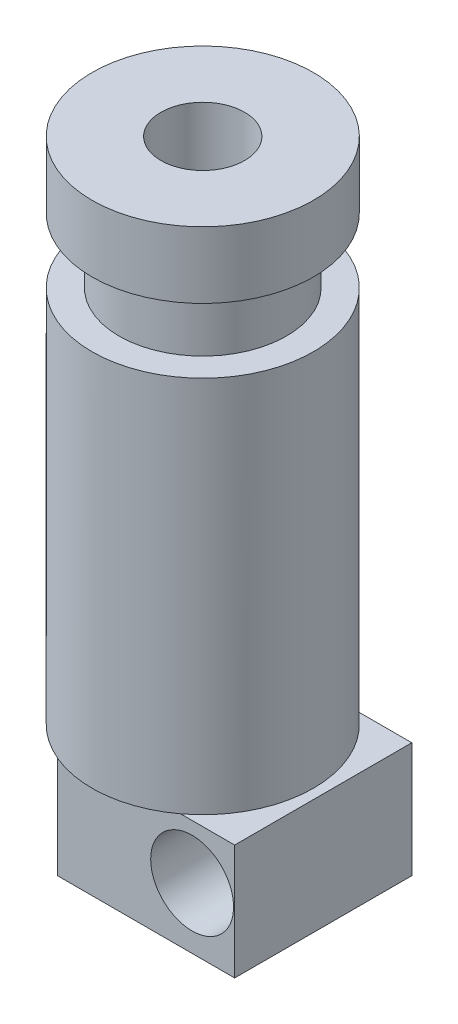
ISO-10303-21;
HEADER;
FILE_DESCRIPTION(('STEP AP214'),'2;1');
FILE_NAME('part.step','',(''),(''),'','','');
FILE_SCHEMA(('AUTOMOTIVE_DESIGN { 1 0 10303 214 1 1 1 1 }'));
ENDSEC;
DATA;
#1=APPLICATION_CONTEXT('core data for automotive mechanical design processes');
#2=APPLICATION_PROTOCOL_DEFINITION('international standard','automotive_design',2000,#1);
#3=PRODUCT_CONTEXT('',#1,'mechanical');
#4=PRODUCT('Part','Part','',(#3));
#5=PRODUCT_RELATED_PRODUCT_CATEGORY('part','',(#4));
#6=PRODUCT_DEFINITION_FORMATION('','',#4);
#7=PRODUCT_DEFINITION_CONTEXT('part definition',#1,'design');
#8=PRODUCT_DEFINITION('design','',#6,#7);
#9=PRODUCT_DEFINITION_SHAPE('','',#8);
#10=(LENGTH_UNIT() NAMED_UNIT(*) SI_UNIT(.MILLI.,.METRE.));
#11=(NAMED_UNIT(*) PLANE_ANGLE_UNIT() SI_UNIT($,.RADIAN.));
#12=(NAMED_UNIT(*) SI_UNIT($,.STERADIAN.) SOLID_ANGLE_UNIT());
#13=UNCERTAINTY_MEASURE_WITH_UNIT(LENGTH_MEASURE(1.E-05),#10,'distance_accuracy_value','');
#14=(GEOMETRIC_REPRESENTATION_CONTEXT(3) GLOBAL_UNCERTAINTY_ASSIGNED_CONTEXT((#13)) GLOBAL_UNIT_ASSIGNED_CONTEXT((#10,
#11,#12)) REPRESENTATION_CONTEXT('',''));
#15=CARTESIAN_POINT('',(0.,0.,0.));
#16=DIRECTION('',(0.,0.,1.));
#17=DIRECTION('',(1.,0.,0.));
#18=AXIS2_PLACEMENT_3D('',#15,#16,#17);
#19=CARTESIAN_POINT('',(0.,-8.255,0.));
#20=DIRECTION('',(0.,1.,0.));
#21=DIRECTION('',(0.,0.,1.));
#22=AXIS2_PLACEMENT_3D('',#19,#20,#21);
#23=PLANE('',#22);
#24=DIRECTION('',(0.,0.,-1.));
#25=VECTOR('',#24,1.);
#26=CARTESIAN_POINT('',(-4.064,-8.255,-6.35));
#27=LINE('',#26,#25);
#28=CARTESIAN_POINT('',(-4.064,-8.255,6.35));
#29=VERTEX_POINT('',#28);
#30=CARTESIAN_POINT('',(-4.064,-8.255,-6.35));
#31=VERTEX_POINT('',#30);
#32=EDGE_CURVE('E89',#29,#31,#27,.T.);
#33=ORIENTED_EDGE('',*,*,#32,.T.);
#34=DIRECTION('',(1.,0.,0.));
#35=VECTOR('',#34,1.);
#36=CARTESIAN_POINT('',(-4.064,-8.255,-6.35));
#37=LINE('',#36,#35);
#38=CARTESIAN_POINT('',(8.636,-8.255,-6.35));
#39=VERTEX_POINT('',#38);
#40=EDGE_CURVE('E79',#31,#39,#37,.T.);
#41=ORIENTED_EDGE('',*,*,#40,.T.);
#42=DIRECTION('',(0.,0.,1.));
#43=VECTOR('',#42,1.);
#44=CARTESIAN_POINT('',(8.636,-8.255,-6.35));
#45=LINE('',#44,#43);
#46=CARTESIAN_POINT('',(8.636,-8.255,6.35));
#47=VERTEX_POINT('',#46);
#48=EDGE_CURVE('E88',#39,#47,#45,.T.);
#49=ORIENTED_EDGE('',*,*,#48,.T.);
#50=DIRECTION('',(-1.,0.,0.));
#51=VECTOR('',#50,1.);
#52=CARTESIAN_POINT('',(-4.064,-8.255,6.35));
#53=LINE('',#52,#51);
#54=EDGE_CURVE('E94',#47,#29,#53,.T.);
#55=ORIENTED_EDGE('',*,*,#54,.T.);
#56=EDGE_LOOP('',(#33,#41,#49,#55));
#57=FACE_BOUND('',#56,.T.);
#58=CARTESIAN_POINT('',(0.,-8.255,0.));
#59=DIRECTION('',(0.,1.,0.));
#60=DIRECTION('',(0.,0.,1.));
#61=AXIS2_PLACEMENT_3D('',#58,#59,#60);
#62=CIRCLE('',#61,3.96875);
#63=CARTESIAN_POINT('',(0.,-8.255,3.96875));
#64=VERTEX_POINT('',#63);
#65=EDGE_CURVE('E11',#64,#64,#62,.F.);
#66=ORIENTED_EDGE('',*,*,#65,.F.);
#67=EDGE_LOOP('',(#66));
#68=FACE_BOUND('',#67,.T.);
#69=ADVANCED_FACE('F32',(#57,#68),#23,.F.);
#70=CARTESIAN_POINT('',(0.,0.,0.));
#71=DIRECTION('',(0.,1.,0.));
#72=DIRECTION('',(0.,0.,1.));
#73=AXIS2_PLACEMENT_3D('',#70,#71,#72);
#74=PLANE('',#73);
#75=DIRECTION('',(-1.,0.,0.));
#76=VECTOR('',#75,1.);
#77=CARTESIAN_POINT('',(-4.064,0.,6.35));
#78=LINE('',#77,#76);
#79=CARTESIAN_POINT('',(4.7625,0.,6.35));
#80=VERTEX_POINT('',#79);
#81=CARTESIAN_POINT('',(-4.064,0.,6.35));
#82=VERTEX_POINT('',#81);
#83=EDGE_CURVE('E41',#80,#82,#78,.T.);
#84=ORIENTED_EDGE('',*,*,#83,.F.);
#85=CARTESIAN_POINT('',(0.,0.,0.));
#86=DIRECTION('',(0.,1.,0.));
#87=DIRECTION('',(0.,0.,1.));
#88=AXIS2_PLACEMENT_3D('',#85,#86,#87);
#89=CIRCLE('',#88,7.9375);
#90=CARTESIAN_POINT('',(4.7625,0.,-6.35));
#91=VERTEX_POINT('',#90);
#92=EDGE_CURVE('E127',#91,#80,#89,.T.);
#93=ORIENTED_EDGE('',*,*,#92,.F.);
#94=DIRECTION('',(1.,0.,0.));
#95=VECTOR('',#94,1.);
#96=CARTESIAN_POINT('',(-4.064,0.,-6.35));
#97=LINE('',#96,#95);
#98=CARTESIAN_POINT('',(-4.064,0.,-6.35));
#99=VERTEX_POINT('',#98);
#100=EDGE_CURVE('E53',#99,#91,#97,.T.);
#101=ORIENTED_EDGE('',*,*,#100,.F.);
#102=DIRECTION('',(0.,0.,-1.));
#103=VECTOR('',#102,1.);
#104=CARTESIAN_POINT('',(-4.064,0.,-6.35));
#105=LINE('',#104,#103);
#106=EDGE_CURVE('E48',#82,#99,#105,.T.);
#107=ORIENTED_EDGE('',*,*,#106,.F.);
#108=EDGE_LOOP('',(#84,#93,#101,#107));
#109=FACE_BOUND('',#108,.T.);
#110=ADVANCED_FACE('F169',(#109),#74,.F.);
#111=CARTESIAN_POINT('',(0.,27.10000002,0.));
#112=DIRECTION('',(0.,1.,0.));
#113=DIRECTION('',(0.,0.,1.));
#114=AXIS2_PLACEMENT_3D('',#111,#112,#113);
#115=PLANE('',#114);
#116=CARTESIAN_POINT('',(0.,27.10000002,0.));
#117=DIRECTION('',(0.,1.,0.));
#118=DIRECTION('',(0.,0.,1.));
#119=AXIS2_PLACEMENT_3D('',#116,#117,#118);
#120=CIRCLE('',#119,7.9375);
#121=CARTESIAN_POINT('',(0.,27.10000002,7.9375));
#122=VERTEX_POINT('',#121);
#123=EDGE_CURVE('E122',#122,#122,#120,.T.);
#124=ORIENTED_EDGE('',*,*,#123,.T.);
#125=EDGE_LOOP('',(#124));
#126=FACE_BOUND('',#125,.T.);
#127=CARTESIAN_POINT('',(0.,27.10000002,0.));
#128=DIRECTION('',(0.,1.,0.));
#129=DIRECTION('',(0.,0.,1.));
#130=AXIS2_PLACEMENT_3D('',#127,#128,#129);
#131=CIRCLE('',#130,6.);
#132=CARTESIAN_POINT('',(0.,27.10000002,6.));
#133=VERTEX_POINT('',#132);
#134=EDGE_CURVE('E113',#133,#133,#131,.T.);
#135=ORIENTED_EDGE('',*,*,#134,.F.);
#136=EDGE_LOOP('',(#135));
#137=FACE_BOUND('',#136,.T.);
#138=ADVANCED_FACE('F174',(#126,#137),#115,.T.);
#139=CARTESIAN_POINT('',(0.,27.10000002,0.));
#140=DIRECTION('',(0.,-1.,0.));
#141=DIRECTION('',(0.,0.,-1.));
#142=AXIS2_PLACEMENT_3D('',#139,#140,#141);
#143=CYLINDRICAL_SURFACE('',#142,7.9375);
#144=ORIENTED_EDGE('',*,*,#123,.F.);
#145=EDGE_LOOP('',(#144));
#146=FACE_BOUND('',#145,.T.);
#147=EDGE_CURVE('E125',#80,#91,#89,.T.);
#148=ORIENTED_EDGE('',*,*,#147,.T.);
#149=ORIENTED_EDGE('',*,*,#92,.T.);
#150=EDGE_LOOP('',(#148,#149));
#151=FACE_BOUND('',#150,.T.);
#152=ADVANCED_FACE('F34',(#146,#151),#143,.T.);
#153=CARTESIAN_POINT('',(0.,-9.39999998,0.));
#154=DIRECTION('',(0.,1.,0.));
#155=DIRECTION('',(0.,0.,1.));
#156=AXIS2_PLACEMENT_3D('',#153,#154,#155);
#157=CYLINDRICAL_SURFACE('',#156,3.);
#158=CARTESIAN_POINT('',(0.,0.,0.));
#159=DIRECTION('',(0.,1.,0.));
#160=DIRECTION('',(0.,0.,1.));
#161=AXIS2_PLACEMENT_3D('',#158,#159,#160);
#162=CIRCLE('',#161,3.);
#163=CARTESIAN_POINT('',(0.,0.,3.));
#164=VERTEX_POINT('',#163);
#165=EDGE_CURVE('E119',#164,#164,#162,.T.);
#166=ORIENTED_EDGE('',*,*,#165,.F.);
#167=EDGE_LOOP('',(#166));
#168=FACE_BOUND('',#167,.T.);
#169=CARTESIAN_POINT('',(0.,36.50000002,0.));
#170=DIRECTION('',(0.,1.,0.));
#171=DIRECTION('',(0.,0.,1.));
#172=AXIS2_PLACEMENT_3D('',#169,#170,#171);
#173=CIRCLE('',#172,3.);
#174=CARTESIAN_POINT('',(0.,36.50000002,3.));
#175=VERTEX_POINT('',#174);
#176=EDGE_CURVE('E101',#175,#175,#173,.T.);
#177=ORIENTED_EDGE('',*,*,#176,.T.);
#178=EDGE_LOOP('',(#177));
#179=FACE_BOUND('',#178,.T.);
#180=ADVANCED_FACE('F296',(#168,#179),#157,.F.);
#181=CARTESIAN_POINT('',(0.,31.74000002,0.));
#182=DIRECTION('',(0.,-1.,0.));
#183=DIRECTION('',(0.,0.,-1.));
#184=AXIS2_PLACEMENT_3D('',#181,#182,#183);
#185=CYLINDRICAL_SURFACE('',#184,6.);
#186=CARTESIAN_POINT('',(0.,31.74000002,0.));
#187=DIRECTION('',(0.,1.,0.));
#188=DIRECTION('',(0.,0.,1.));
#189=AXIS2_PLACEMENT_3D('',#186,#187,#188);
#190=CIRCLE('',#189,6.);
#191=CARTESIAN_POINT('',(0.,31.74000002,6.));
#192=VERTEX_POINT('',#191);
#193=EDGE_CURVE('E116',#192,#192,#190,.T.);
#194=ORIENTED_EDGE('',*,*,#193,.F.);
#195=EDGE_LOOP('',(#194));
#196=FACE_BOUND('',#195,.T.);
#197=ORIENTED_EDGE('',*,*,#134,.T.);
#198=EDGE_LOOP('',(#197));
#199=FACE_BOUND('',#198,.T.);
#200=ADVANCED_FACE('F323',(#196,#199),#185,.T.);
#201=CARTESIAN_POINT('',(0.,31.74000002,0.));
#202=DIRECTION('',(0.,1.,0.));
#203=DIRECTION('',(0.,0.,1.));
#204=AXIS2_PLACEMENT_3D('',#201,#202,#203);
#205=PLANE('',#204);
#206=CARTESIAN_POINT('',(0.,31.74000002,0.));
#207=DIRECTION('',(0.,1.,0.));
#208=DIRECTION('',(0.,0.,1.));
#209=AXIS2_PLACEMENT_3D('',#206,#207,#208);
#210=CIRCLE('',#209,7.9375);
#211=CARTESIAN_POINT('',(0.,31.74000002,7.9375));
#212=VERTEX_POINT('',#211);
#213=EDGE_CURVE('E104',#212,#212,#210,.T.);
#214=ORIENTED_EDGE('',*,*,#213,.F.);
#215=EDGE_LOOP('',(#214));
#216=FACE_BOUND('',#215,.T.);
#217=ORIENTED_EDGE('',*,*,#193,.T.);
#218=EDGE_LOOP('',(#217));
#219=FACE_BOUND('',#218,.T.);
#220=ADVANCED_FACE('F332',(#216,#219),#205,.F.);
#221=CARTESIAN_POINT('',(0.,36.50000002,0.));
#222=DIRECTION('',(0.,-1.,0.));
#223=DIRECTION('',(0.,0.,-1.));
#224=AXIS2_PLACEMENT_3D('',#221,#222,#223);
#225=CYLINDRICAL_SURFACE('',#224,7.9375);
#226=CARTESIAN_POINT('',(0.,36.50000002,0.));
#227=DIRECTION('',(0.,1.,0.));
#228=DIRECTION('',(0.,0.,1.));
#229=AXIS2_PLACEMENT_3D('',#226,#227,#228);
#230=CIRCLE('',#229,7.9375);
#231=CARTESIAN_POINT('',(0.,36.50000002,7.9375));
#232=VERTEX_POINT('',#231);
#233=EDGE_CURVE('E110',#232,#232,#230,.T.);
#234=ORIENTED_EDGE('',*,*,#233,.F.);
#235=EDGE_LOOP('',(#234));
#236=FACE_BOUND('',#235,.T.);
#237=ORIENTED_EDGE('',*,*,#213,.T.);
#238=EDGE_LOOP('',(#237));
#239=FACE_BOUND('',#238,.T.);
#240=ADVANCED_FACE('F313',(#236,#239),#225,.T.);
#241=CARTESIAN_POINT('',(0.,36.50000002,0.));
#242=DIRECTION('',(0.,1.,0.));
#243=DIRECTION('',(0.,0.,1.));
#244=AXIS2_PLACEMENT_3D('',#241,#242,#243);
#245=PLANE('',#244);
#246=ORIENTED_EDGE('',*,*,#176,.F.);
#247=EDGE_LOOP('',(#246));
#248=FACE_BOUND('',#247,.T.);
#249=ORIENTED_EDGE('',*,*,#233,.T.);
#250=EDGE_LOOP('',(#249));
#251=FACE_BOUND('',#250,.T.);
#252=ADVANCED_FACE('F165',(#248,#251),#245,.T.);
#253=CARTESIAN_POINT('',(-4.064,-8.255,6.35));
#254=DIRECTION('',(0.,0.,-1.));
#255=DIRECTION('',(-1.,0.,0.));
#256=AXIS2_PLACEMENT_3D('',#253,#254,#255);
#257=PLANE('',#256);
#258=CARTESIAN_POINT('',(5.588,-3.88806081561199,6.35));
#259=DIRECTION('',(0.,0.,-1.));
#260=DIRECTION('',(-1.,0.,0.));
#261=AXIS2_PLACEMENT_3D('',#258,#259,#260);
#262=CIRCLE('',#261,2.9718);
#263=CARTESIAN_POINT('',(2.6162,-3.88806081561199,6.35));
#264=VERTEX_POINT('',#263);
#265=EDGE_CURVE('E195',#264,#264,#262,.T.);
#266=ORIENTED_EDGE('',*,*,#265,.T.);
#267=EDGE_LOOP('',(#266));
#268=FACE_BOUND('',#267,.T.);
#269=CARTESIAN_POINT('',(8.636,0.,6.35));
#270=VERTEX_POINT('',#269);
#271=EDGE_CURVE('E98',#270,#80,#78,.T.);
#272=ORIENTED_EDGE('',*,*,#271,.T.);
#273=ORIENTED_EDGE('',*,*,#83,.T.);
#274=DIRECTION('',(0.,1.,0.));
#275=VECTOR('',#274,1.);
#276=CARTESIAN_POINT('',(-4.064,-8.255,6.35));
#277=LINE('',#276,#275);
#278=EDGE_CURVE('E150',#29,#82,#277,.T.);
#279=ORIENTED_EDGE('',*,*,#278,.F.);
#280=ORIENTED_EDGE('',*,*,#54,.F.);
#281=DIRECTION('',(0.,1.,0.));
#282=VECTOR('',#281,1.);
#283=CARTESIAN_POINT('',(8.636,-8.255,6.35));
#284=LINE('',#283,#282);
#285=EDGE_CURVE('E106',#47,#270,#284,.T.);
#286=ORIENTED_EDGE('',*,*,#285,.T.);
#287=EDGE_LOOP('',(#272,#273,#279,#280,#286));
#288=FACE_BOUND('',#287,.T.);
#289=ADVANCED_FACE('F143',(#268,#288),#257,.F.);
#290=CARTESIAN_POINT('',(8.636,-8.255,-6.35));
#291=DIRECTION('',(-1.,0.,0.));
#292=DIRECTION('',(0.,0.,1.));
#293=AXIS2_PLACEMENT_3D('',#290,#291,#292);
#294=PLANE('',#293);
#295=DIRECTION('',(0.,0.,1.));
#296=VECTOR('',#295,1.);
#297=CARTESIAN_POINT('',(8.636,0.,-6.35));
#298=LINE('',#297,#296);
#299=CARTESIAN_POINT('',(8.636,0.,-6.35));
#300=VERTEX_POINT('',#299);
#301=EDGE_CURVE('E145',#300,#270,#298,.T.);
#302=ORIENTED_EDGE('',*,*,#301,.T.);
#303=ORIENTED_EDGE('',*,*,#285,.F.);
#304=ORIENTED_EDGE('',*,*,#48,.F.);
#305=DIRECTION('',(0.,1.,0.));
#306=VECTOR('',#305,1.);
#307=CARTESIAN_POINT('',(8.636,-8.255,-6.35));
#308=LINE('',#307,#306);
#309=EDGE_CURVE('E85',#39,#300,#308,.T.);
#310=ORIENTED_EDGE('',*,*,#309,.T.);
#311=EDGE_LOOP('',(#302,#303,#304,#310));
#312=FACE_BOUND('',#311,.T.);
#313=ADVANCED_FACE('F156',(#312),#294,.F.);
#314=CARTESIAN_POINT('',(-4.064,-8.255,-6.35));
#315=DIRECTION('',(0.,0.,1.));
#316=DIRECTION('',(1.,0.,0.));
#317=AXIS2_PLACEMENT_3D('',#314,#315,#316);
#318=PLANE('',#317);
#319=CARTESIAN_POINT('',(5.588,-3.88806081561199,-6.35));
#320=DIRECTION('',(0.,0.,-1.));
#321=DIRECTION('',(-1.,0.,0.));
#322=AXIS2_PLACEMENT_3D('',#319,#320,#321);
#323=CIRCLE('',#322,2.9718);
#324=CARTESIAN_POINT('',(2.6162,-3.88806081561199,-6.35));
#325=VERTEX_POINT('',#324);
#326=EDGE_CURVE('E192',#325,#325,#323,.T.);
#327=ORIENTED_EDGE('',*,*,#326,.F.);
#328=EDGE_LOOP('',(#327));
#329=FACE_BOUND('',#328,.T.);
#330=ORIENTED_EDGE('',*,*,#100,.T.);
#331=EDGE_CURVE('E140',#91,#300,#97,.T.);
#332=ORIENTED_EDGE('',*,*,#331,.T.);
#333=ORIENTED_EDGE('',*,*,#309,.F.);
#334=ORIENTED_EDGE('',*,*,#40,.F.);
#335=DIRECTION('',(0.,1.,0.));
#336=VECTOR('',#335,1.);
#337=CARTESIAN_POINT('',(-4.064,-8.255,-6.35));
#338=LINE('',#337,#336);
#339=EDGE_CURVE('E83',#31,#99,#338,.T.);
#340=ORIENTED_EDGE('',*,*,#339,.T.);
#341=EDGE_LOOP('',(#330,#332,#333,#334,#340));
#342=FACE_BOUND('',#341,.T.);
#343=ADVANCED_FACE('F81',(#329,#342),#318,.F.);
#344=CARTESIAN_POINT('',(-4.064,-8.255,-6.35));
#345=DIRECTION('',(1.,0.,0.));
#346=DIRECTION('',(0.,0.,-1.));
#347=AXIS2_PLACEMENT_3D('',#344,#345,#346);
#348=PLANE('',#347);
#349=ORIENTED_EDGE('',*,*,#106,.T.);
#350=ORIENTED_EDGE('',*,*,#339,.F.);
#351=ORIENTED_EDGE('',*,*,#32,.F.);
#352=ORIENTED_EDGE('',*,*,#278,.T.);
#353=EDGE_LOOP('',(#349,#350,#351,#352));
#354=FACE_BOUND('',#353,.T.);
#355=ADVANCED_FACE('F100',(#354),#348,.F.);
#356=CARTESIAN_POINT('',(0.,0.,0.));
#357=DIRECTION('',(0.,1.,0.));
#358=DIRECTION('',(0.,0.,1.));
#359=AXIS2_PLACEMENT_3D('',#356,#357,#358);
#360=PLANE('',#359);
#361=ORIENTED_EDGE('',*,*,#147,.F.);
#362=ORIENTED_EDGE('',*,*,#271,.F.);
#363=ORIENTED_EDGE('',*,*,#301,.F.);
#364=ORIENTED_EDGE('',*,*,#331,.F.);
#365=EDGE_LOOP('',(#361,#362,#363,#364));
#366=FACE_BOUND('',#365,.T.);
#367=ADVANCED_FACE('F138',(#366),#360,.T.);
#368=CARTESIAN_POINT('',(0.,0.,0.));
#369=DIRECTION('',(0.,1.,0.));
#370=DIRECTION('',(0.,0.,1.));
#371=AXIS2_PLACEMENT_3D('',#368,#369,#370);
#372=CIRCLE('',#371,0.02);
#373=CARTESIAN_POINT('',(0.,0.,0.02));
#374=VERTEX_POINT('',#373);
#375=EDGE_CURVE('E190',#374,#374,#372,.T.);
#376=ORIENTED_EDGE('',*,*,#375,.F.);
#377=EDGE_LOOP('',(#376));
#378=FACE_BOUND('',#377,.T.);
#379=ORIENTED_EDGE('',*,*,#165,.T.);
#380=EDGE_LOOP('',(#379));
#381=FACE_BOUND('',#380,.T.);
#382=ADVANCED_FACE('F179',(#378,#381),#360,.T.);
#383=CARTESIAN_POINT('',(0.,-9.525,0.));
#384=DIRECTION('',(0.,1.,0.));
#385=DIRECTION('',(0.,0.,1.));
#386=AXIS2_PLACEMENT_3D('',#383,#384,#385);
#387=CYLINDRICAL_SURFACE('',#386,3.96875);
#388=CARTESIAN_POINT('',(0.,-9.525,0.));
#389=DIRECTION('',(0.,-1.,0.));
#390=DIRECTION('',(0.,0.,-1.));
#391=AXIS2_PLACEMENT_3D('',#388,#389,#390);
#392=CIRCLE('',#391,3.96875);
#393=CARTESIAN_POINT('',(0.,-9.525,-3.96875));
#394=VERTEX_POINT('',#393);
#395=EDGE_CURVE('E154',#394,#394,#392,.T.);
#396=ORIENTED_EDGE('',*,*,#395,.F.);
#397=EDGE_LOOP('',(#396));
#398=FACE_BOUND('',#397,.T.);
#399=ORIENTED_EDGE('',*,*,#65,.T.);
#400=EDGE_LOOP('',(#399));
#401=FACE_BOUND('',#400,.T.);
#402=ADVANCED_FACE('F177',(#398,#401),#387,.T.);
#403=CARTESIAN_POINT('',(0.,-9.525,0.));
#404=DIRECTION('',(0.,1.,0.));
#405=DIRECTION('',(0.,0.,-1.));
#406=AXIS2_PLACEMENT_3D('',#403,#404,#405);
#407=CONICAL_SURFACE('',#406,3.96875,1.13446401379632);
#408=CARTESIAN_POINT('',(0.,-11.303,0.));
#409=DIRECTION('',(0.,-1.,0.));
#410=DIRECTION('',(0.,0.,-1.));
#411=AXIS2_PLACEMENT_3D('',#408,#409,#410);
#412=CIRCLE('',#411,0.15581669533398);
#413=CARTESIAN_POINT('',(0.,-11.303,-0.155816695333982));
#414=VERTEX_POINT('',#413);
#415=EDGE_CURVE('E201',#414,#414,#412,.T.);
#416=CARTESIAN_POINT('',(0.,-11.303,-0.155816695333982));
#417=CARTESIAN_POINT('',(0.,-11.2844791666667,-0.195534750590919));
#418=CARTESIAN_POINT('',(0.,-11.2659583333333,-0.235252805847857));
#419=CARTESIAN_POINT('',(0.,-11.2289166666667,-0.314688916361733));
#420=CARTESIAN_POINT('',(0.,-11.2103958333333,-0.354406971618671));
#421=CARTESIAN_POINT('',(0.,-11.1733541666667,-0.433843082132546));
#422=CARTESIAN_POINT('',(0.,-11.1548333333333,-0.473561137389484));
#423=CARTESIAN_POINT('',(0.,-11.1177916666667,-0.552997247903359));
#424=CARTESIAN_POINT('',(0.,-11.0992708333333,-0.592715303160297));
#425=CARTESIAN_POINT('',(0.,-11.0622291666667,-0.672151413674172));
#426=CARTESIAN_POINT('',(0.,-11.0437083333333,-0.71186946893111));
#427=CARTESIAN_POINT('',(0.,-11.0066666666667,-0.791305579444985));
#428=CARTESIAN_POINT('',(0.,-10.9881458333333,-0.831023634701923));
#429=CARTESIAN_POINT('',(0.,-10.9511041666667,-0.910459745215798));
#430=CARTESIAN_POINT('',(0.,-10.9325833333333,-0.950177800472736));
#431=CARTESIAN_POINT('',(0.,-10.8955416666667,-1.02961391098661));
#432=CARTESIAN_POINT('',(0.,-10.8770208333333,-1.06933196624355));
#433=CARTESIAN_POINT('',(0.,-10.8399791666667,-1.14876807675742));
#434=CARTESIAN_POINT('',(0.,-10.8214583333333,-1.18848613201436));
#435=CARTESIAN_POINT('',(0.,-10.7844166666667,-1.26792224252824));
#436=CARTESIAN_POINT('',(0.,-10.7658958333333,-1.30764029778518));
#437=CARTESIAN_POINT('',(0.,-10.7288541666667,-1.38707640829905));
#438=CARTESIAN_POINT('',(0.,-10.7103333333333,-1.42679446355599));
#439=CARTESIAN_POINT('',(0.,-10.6732916666667,-1.50623057406986));
#440=CARTESIAN_POINT('',(0.,-10.6547708333333,-1.5459486293268));
#441=CARTESIAN_POINT('',(0.,-10.6177291666667,-1.62538473984068));
#442=CARTESIAN_POINT('',(0.,-10.5992083333333,-1.66510279509761));
#443=CARTESIAN_POINT('',(0.,-10.5621666666667,-1.74453890561149));
#444=CARTESIAN_POINT('',(0.,-10.5436458333333,-1.78425696086843));
#445=CARTESIAN_POINT('',(0.,-10.5066041666667,-1.8636930713823));
#446=CARTESIAN_POINT('',(0.,-10.4880833333333,-1.90341112663924));
#447=CARTESIAN_POINT('',(0.,-10.4510416666667,-1.98284723715312));
#448=CARTESIAN_POINT('',(0.,-10.4325208333333,-2.02256529241005));
#449=CARTESIAN_POINT('',(0.,-10.3954791666667,-2.10200140292393));
#450=CARTESIAN_POINT('',(0.,-10.3769583333333,-2.14171945818087));
#451=CARTESIAN_POINT('',(0.,-10.3399166666667,-2.22115556869474));
#452=CARTESIAN_POINT('',(0.,-10.3213958333333,-2.26087362395168));
#453=CARTESIAN_POINT('',(0.,-10.2843541666667,-2.34030973446556));
#454=CARTESIAN_POINT('',(0.,-10.2658333333333,-2.38002778972249));
#455=CARTESIAN_POINT('',(0.,-10.2287916666667,-2.45946390023637));
#456=CARTESIAN_POINT('',(0.,-10.2102708333333,-2.49918195549331));
#457=CARTESIAN_POINT('',(0.,-10.1732291666667,-2.57861806600718));
#458=CARTESIAN_POINT('',(0.,-10.1547083333333,-2.61833612126412));
#459=CARTESIAN_POINT('',(0.,-10.1176666666667,-2.697772231778));
#460=CARTESIAN_POINT('',(0.,-10.0991458333333,-2.73749028703493));
#461=CARTESIAN_POINT('',(0.,-10.0621041666667,-2.81692639754881));
#462=CARTESIAN_POINT('',(0.,-10.0435833333333,-2.85664445280575));
#463=CARTESIAN_POINT('',(0.,-10.0065416666667,-2.93608056331962));
#464=CARTESIAN_POINT('',(0.,-9.98802083333333,-2.97579861857656));
#465=CARTESIAN_POINT('',(0.,-9.95097916666666,-3.05523472909043));
#466=CARTESIAN_POINT('',(0.,-9.93245833333333,-3.09495278434737));
#467=CARTESIAN_POINT('',(0.,-9.89541666666667,-3.17438889486125));
#468=CARTESIAN_POINT('',(0.,-9.87689583333333,-3.21410695011819));
#469=CARTESIAN_POINT('',(0.,-9.83985416666667,-3.29354306063206));
#470=CARTESIAN_POINT('',(0.,-9.82133333333333,-3.333261115889));
#471=CARTESIAN_POINT('',(0.,-9.78429166666666,-3.41269722640287));
#472=CARTESIAN_POINT('',(0.,-9.76577083333333,-3.45241528165981));
#473=CARTESIAN_POINT('',(0.,-9.72872916666667,-3.53185139217369));
#474=CARTESIAN_POINT('',(0.,-9.71020833333333,-3.57156944743062));
#475=CARTESIAN_POINT('',(0.,-9.67316666666667,-3.6510055579445));
#476=CARTESIAN_POINT('',(0.,-9.65464583333333,-3.69072361320144));
#477=CARTESIAN_POINT('',(0.,-9.61760416666667,-3.77015972371531));
#478=CARTESIAN_POINT('',(0.,-9.59908333333333,-3.80987777897225));
#479=CARTESIAN_POINT('',(0.,-9.56204166666667,-3.88931388948613));
#480=CARTESIAN_POINT('',(0.,-9.54352083333333,-3.92903194474306));
#481=CARTESIAN_POINT('',(0.,-9.525,-3.96875));
#482=B_SPLINE_CURVE_WITH_KNOTS('',3,(#416,#417,#418,#419,#420,#421,#422,#423,#424,#425,#426,
#427,#428,#429,#430,#431,#432,#433,#434,#435,#436,#437,#438,#439,#440,#441,#442,#443,#444,#445,
#446,#447,#448,#449,#450,#451,#452,#453,#454,#455,#456,#457,#458,#459,#460,#461,#462,#463,#464,
#465,#466,#467,#468,#469,#470,#471,#472,#473,#474,#475,#476,#477,#478,#479,#480,#481),
.UNSPECIFIED.,.F.,.F.,(4,2,2,2,2,2,2,2,2,2,2,2,2,2,2,2,2,2,2,2,2,2,2,2,2,2,2,2,2,2,2,2,4),(0.,
0.131472075463912,0.262944150927823,0.394416226391734,0.525888301855646,0.657360377319557,
0.788832452783468,0.92030452824738,1.05177660371129,1.1832486791752,1.31472075463911,
1.44619283010303,1.57766490556694,1.70913698103085,1.84060905649476,1.97208113195867,
2.10355320742258,2.23502528288649,2.36649735835041,2.49796943381432,2.62944150927823,
2.76091358474214,2.89238566020605,3.02385773566996,3.15532981113387,3.28680188659778,
3.4182739620617,3.54974603752561,3.68121811298952,3.81269018845343,3.94416226391734,
4.07563433938125,4.20710641484516),.UNSPECIFIED.);
#483=EDGE_CURVE('BSEAM186',#414,#394,#482,.T.);
#484=ORIENTED_EDGE('',*,*,#415,.F.);
#485=ORIENTED_EDGE('',*,*,#395,.T.);
#486=ORIENTED_EDGE('',*,*,#483,.T.);
#487=ORIENTED_EDGE('',*,*,#483,.F.);
#488=EDGE_LOOP('',(#484,#486,#485,#487));
#489=FACE_BOUND('',#488,.T.);
#490=ADVANCED_FACE('F186',(#489),#407,.T.);
#491=CARTESIAN_POINT('',(0.,-11.303,0.));
#492=DIRECTION('',(0.,-1.,0.));
#493=DIRECTION('',(0.,0.,-1.));
#494=AXIS2_PLACEMENT_3D('',#491,#492,#493);
#495=PLANE('',#494);
#496=CARTESIAN_POINT('',(0.,-11.303,0.));
#497=DIRECTION('',(0.,-1.,0.));
#498=DIRECTION('',(0.,0.,-1.));
#499=AXIS2_PLACEMENT_3D('',#496,#497,#498);
#500=CIRCLE('',#499,0.02);
#501=CARTESIAN_POINT('',(0.,-11.303,-0.02));
#502=VERTEX_POINT('',#501);
#503=EDGE_CURVE('E36',#502,#502,#500,.T.);
#504=ORIENTED_EDGE('',*,*,#503,.F.);
#505=EDGE_LOOP('',(#504));
#506=FACE_BOUND('',#505,.T.);
#507=ORIENTED_EDGE('',*,*,#415,.T.);
#508=EDGE_LOOP('',(#507));
#509=FACE_BOUND('',#508,.T.);
#510=ADVANCED_FACE('F210',(#506,#509),#495,.T.);
#511=CARTESIAN_POINT('',(5.588,-3.88806081561199,19.05));
#512=DIRECTION('',(0.,0.,-1.));
#513=DIRECTION('',(-1.,0.,0.));
#514=AXIS2_PLACEMENT_3D('',#511,#512,#513);
#515=CYLINDRICAL_SURFACE('',#514,2.9718);
#516=ORIENTED_EDGE('',*,*,#326,.T.);
#517=EDGE_LOOP('',(#516));
#518=FACE_BOUND('',#517,.T.);
#519=ORIENTED_EDGE('',*,*,#265,.F.);
#520=EDGE_LOOP('',(#519));
#521=FACE_BOUND('',#520,.T.);
#522=ADVANCED_FACE('F215',(#518,#521),#515,.F.);
#523=CARTESIAN_POINT('',(0.,-217.49999998,0.));
#524=DIRECTION('',(0.,1.,0.));
#525=DIRECTION('',(0.,0.,1.));
#526=AXIS2_PLACEMENT_3D('',#523,#524,#525);
#527=CYLINDRICAL_SURFACE('',#526,0.02);
#528=ORIENTED_EDGE('',*,*,#375,.T.);
#529=EDGE_LOOP('',(#528));
#530=FACE_BOUND('',#529,.T.);
#531=ORIENTED_EDGE('',*,*,#503,.T.);
#532=EDGE_LOOP('',(#531));
#533=FACE_BOUND('',#532,.T.);
#534=ADVANCED_FACE('F222',(#530,#533),#527,.F.);
#535=CLOSED_SHELL('',(#69,#110,#138,#152,#180,#200,#220,#240,#252,#289,#313,#343,#355,#367,#382,
#402,#490,#510,#522,#534));
#536=MANIFOLD_SOLID_BREP('B2',#535);
#537=ADVANCED_BREP_SHAPE_REPRESENTATION('',(#18,#536),#14);
#538=SHAPE_DEFINITION_REPRESENTATION(#9,#537);
ENDSEC;
END-ISO-10303-21;
